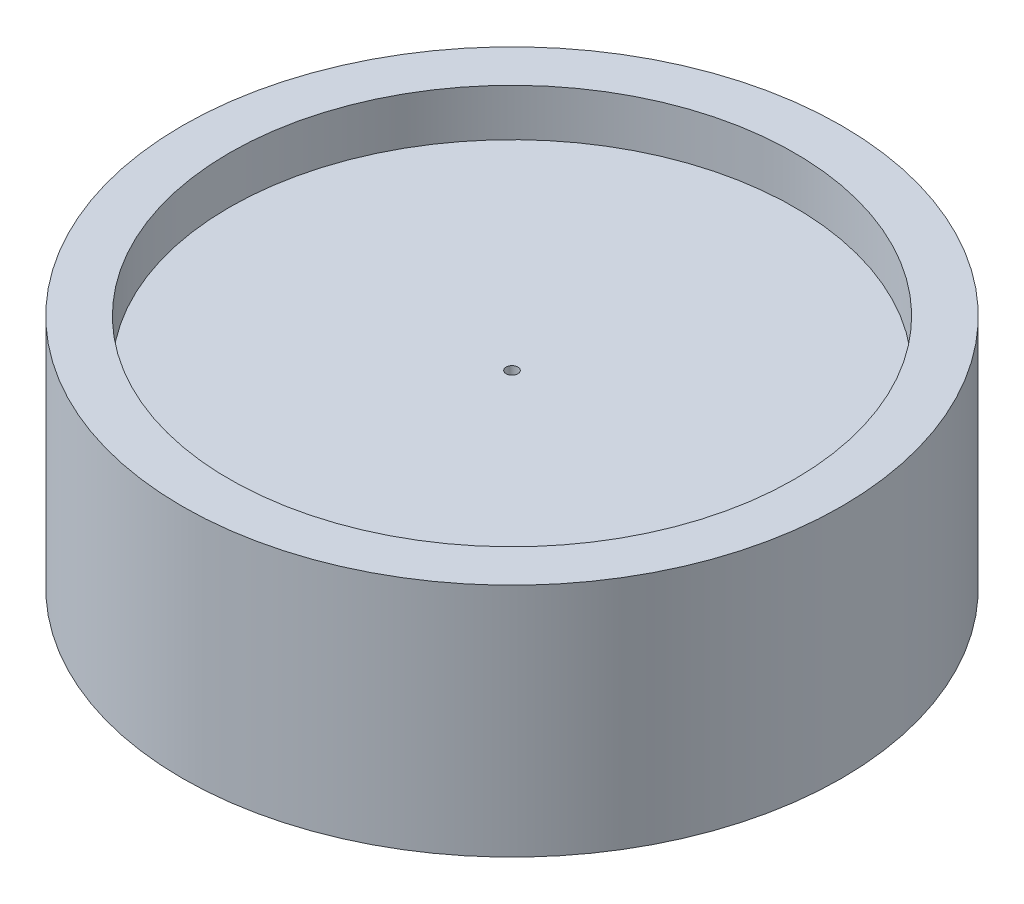
ISO-10303-21;
HEADER;
FILE_DESCRIPTION(('STEP AP214'),'2;1');
FILE_NAME('part.step','',(''),(''),'','','');
FILE_SCHEMA(('AUTOMOTIVE_DESIGN { 1 0 10303 214 1 1 1 1 }'));
ENDSEC;
DATA;
#1=APPLICATION_CONTEXT('core data for automotive mechanical design processes');
#2=APPLICATION_PROTOCOL_DEFINITION('international standard','automotive_design',2000,#1);
#3=PRODUCT_CONTEXT('',#1,'mechanical');
#4=PRODUCT('Part','Part','',(#3));
#5=PRODUCT_RELATED_PRODUCT_CATEGORY('part','',(#4));
#6=PRODUCT_DEFINITION_FORMATION('','',#4);
#7=PRODUCT_DEFINITION_CONTEXT('part definition',#1,'design');
#8=PRODUCT_DEFINITION('design','',#6,#7);
#9=PRODUCT_DEFINITION_SHAPE('','',#8);
#10=(LENGTH_UNIT() NAMED_UNIT(*) SI_UNIT(.MILLI.,.METRE.));
#11=(NAMED_UNIT(*) PLANE_ANGLE_UNIT() SI_UNIT($,.RADIAN.));
#12=(NAMED_UNIT(*) SI_UNIT($,.STERADIAN.) SOLID_ANGLE_UNIT());
#13=UNCERTAINTY_MEASURE_WITH_UNIT(LENGTH_MEASURE(1.E-05),#10,'distance_accuracy_value','');
#14=(GEOMETRIC_REPRESENTATION_CONTEXT(3) GLOBAL_UNCERTAINTY_ASSIGNED_CONTEXT((#13)) GLOBAL_UNIT_ASSIGNED_CONTEXT((#10,
#11,#12)) REPRESENTATION_CONTEXT('',''));
#15=CARTESIAN_POINT('',(0.,0.,0.));
#16=DIRECTION('',(0.,0.,1.));
#17=DIRECTION('',(1.,0.,0.));
#18=AXIS2_PLACEMENT_3D('',#15,#16,#17);
#19=CARTESIAN_POINT('',(0.,0.,0.));
#20=DIRECTION('',(0.,1.,0.));
#21=DIRECTION('',(-1.,0.,0.));
#22=AXIS2_PLACEMENT_3D('',#19,#20,#21);
#23=PLANE('',#22);
#24=CARTESIAN_POINT('',(0.,0.,0.));
#25=DIRECTION('',(0.,1.,0.));
#26=DIRECTION('',(-1.,0.,0.));
#27=AXIS2_PLACEMENT_3D('',#24,#25,#26);
#28=CIRCLE('',#27,1.);
#29=CARTESIAN_POINT('',(-1.,0.,0.));
#30=VERTEX_POINT('',#29);
#31=EDGE_CURVE('E55',#30,#30,#28,.T.);
#32=ORIENTED_EDGE('',*,*,#31,.F.);
#33=EDGE_LOOP('',(#32));
#34=FACE_BOUND('',#33,.T.);
#35=CARTESIAN_POINT('',(0.,0.,0.));
#36=DIRECTION('',(0.,-1.,0.));
#37=DIRECTION('',(1.,0.,0.));
#38=AXIS2_PLACEMENT_3D('',#35,#36,#37);
#39=CIRCLE('',#38,48.);
#40=CARTESIAN_POINT('',(48.,0.,0.));
#41=VERTEX_POINT('',#40);
#42=EDGE_CURVE('E10',#41,#41,#39,.T.);
#43=ORIENTED_EDGE('',*,*,#42,.F.);
#44=EDGE_LOOP('',(#43));
#45=FACE_BOUND('',#44,.T.);
#46=ADVANCED_FACE('F30',(#34,#45),#23,.T.);
#47=CARTESIAN_POINT('',(0.,-12.,0.));
#48=DIRECTION('',(0.,-1.,0.));
#49=DIRECTION('',(1.,0.,0.));
#50=AXIS2_PLACEMENT_3D('',#47,#48,#49);
#51=CYLINDRICAL_SURFACE('',#50,48.);
#52=ORIENTED_EDGE('',*,*,#42,.T.);
#53=EDGE_LOOP('',(#52));
#54=FACE_BOUND('',#53,.T.);
#55=CARTESIAN_POINT('',(0.,8.00000000000001,0.));
#56=DIRECTION('',(0.,-1.,0.));
#57=DIRECTION('',(1.,0.,0.));
#58=AXIS2_PLACEMENT_3D('',#55,#56,#57);
#59=CIRCLE('',#58,48.);
#60=CARTESIAN_POINT('',(48.,8.00000000000001,0.));
#61=VERTEX_POINT('',#60);
#62=EDGE_CURVE('E37',#61,#61,#59,.T.);
#63=ORIENTED_EDGE('',*,*,#62,.F.);
#64=EDGE_LOOP('',(#63));
#65=FACE_BOUND('',#64,.T.);
#66=ADVANCED_FACE('F82',(#54,#65),#51,.F.);
#67=CARTESIAN_POINT('',(48.,8.00000000000001,0.));
#68=DIRECTION('',(0.,1.,0.));
#69=DIRECTION('',(-1.,0.,0.));
#70=AXIS2_PLACEMENT_3D('',#67,#68,#69);
#71=PLANE('',#70);
#72=ORIENTED_EDGE('',*,*,#62,.T.);
#73=EDGE_LOOP('',(#72));
#74=FACE_BOUND('',#73,.T.);
#75=CARTESIAN_POINT('',(0.,8.00000000000001,0.));
#76=DIRECTION('',(0.,-1.,0.));
#77=DIRECTION('',(1.,0.,0.));
#78=AXIS2_PLACEMENT_3D('',#75,#76,#77);
#79=CIRCLE('',#78,56.);
#80=CARTESIAN_POINT('',(56.,8.00000000000001,0.));
#81=VERTEX_POINT('',#80);
#82=EDGE_CURVE('E41',#81,#81,#79,.T.);
#83=ORIENTED_EDGE('',*,*,#82,.F.);
#84=EDGE_LOOP('',(#83));
#85=FACE_BOUND('',#84,.T.);
#86=ADVANCED_FACE('F87',(#74,#85),#71,.T.);
#87=CARTESIAN_POINT('',(0.,-12.,0.));
#88=DIRECTION('',(0.,-1.,0.));
#89=DIRECTION('',(1.,0.,0.));
#90=AXIS2_PLACEMENT_3D('',#87,#88,#89);
#91=CYLINDRICAL_SURFACE('',#90,56.);
#92=ORIENTED_EDGE('',*,*,#82,.T.);
#93=EDGE_LOOP('',(#92));
#94=FACE_BOUND('',#93,.T.);
#95=CARTESIAN_POINT('',(0.,-32.,0.));
#96=DIRECTION('',(0.,-1.,0.));
#97=DIRECTION('',(1.,0.,0.));
#98=AXIS2_PLACEMENT_3D('',#95,#96,#97);
#99=CIRCLE('',#98,56.);
#100=CARTESIAN_POINT('',(56.,-32.,0.));
#101=VERTEX_POINT('',#100);
#102=EDGE_CURVE('E46',#101,#101,#99,.T.);
#103=ORIENTED_EDGE('',*,*,#102,.F.);
#104=EDGE_LOOP('',(#103));
#105=FACE_BOUND('',#104,.T.);
#106=ADVANCED_FACE('F78',(#94,#105),#91,.T.);
#107=CARTESIAN_POINT('',(56.,-32.,0.));
#108=DIRECTION('',(0.,-1.,0.));
#109=DIRECTION('',(1.,0.,0.));
#110=AXIS2_PLACEMENT_3D('',#107,#108,#109);
#111=PLANE('',#110);
#112=ORIENTED_EDGE('',*,*,#102,.T.);
#113=EDGE_LOOP('',(#112));
#114=FACE_BOUND('',#113,.T.);
#115=CARTESIAN_POINT('',(0.,-32.,0.));
#116=DIRECTION('',(0.,-1.,0.));
#117=DIRECTION('',(1.,0.,0.));
#118=AXIS2_PLACEMENT_3D('',#115,#116,#117);
#119=CIRCLE('',#118,48.);
#120=CARTESIAN_POINT('',(48.,-32.,0.));
#121=VERTEX_POINT('',#120);
#122=EDGE_CURVE('E49',#121,#121,#119,.T.);
#123=ORIENTED_EDGE('',*,*,#122,.F.);
#124=EDGE_LOOP('',(#123));
#125=FACE_BOUND('',#124,.T.);
#126=ADVANCED_FACE('F72',(#114,#125),#111,.T.);
#127=CARTESIAN_POINT('',(0.,-12.,0.));
#128=DIRECTION('',(0.,-1.,0.));
#129=DIRECTION('',(1.,0.,0.));
#130=AXIS2_PLACEMENT_3D('',#127,#128,#129);
#131=CYLINDRICAL_SURFACE('',#130,48.);
#132=ORIENTED_EDGE('',*,*,#122,.T.);
#133=EDGE_LOOP('',(#132));
#134=FACE_BOUND('',#133,.T.);
#135=CARTESIAN_POINT('',(0.,-12.,0.));
#136=DIRECTION('',(0.,-1.,0.));
#137=DIRECTION('',(1.,0.,0.));
#138=AXIS2_PLACEMENT_3D('',#135,#136,#137);
#139=CIRCLE('',#138,48.);
#140=CARTESIAN_POINT('',(48.,-12.,0.));
#141=VERTEX_POINT('',#140);
#142=EDGE_CURVE('E52',#141,#141,#139,.T.);
#143=ORIENTED_EDGE('',*,*,#142,.F.);
#144=EDGE_LOOP('',(#143));
#145=FACE_BOUND('',#144,.T.);
#146=ADVANCED_FACE('F67',(#134,#145),#131,.F.);
#147=CARTESIAN_POINT('',(48.,-12.,0.));
#148=DIRECTION('',(0.,-1.,0.));
#149=DIRECTION('',(1.,0.,0.));
#150=AXIS2_PLACEMENT_3D('',#147,#148,#149);
#151=PLANE('',#150);
#152=CARTESIAN_POINT('',(0.,-12.,0.));
#153=DIRECTION('',(0.,-1.,0.));
#154=DIRECTION('',(1.,0.,0.));
#155=AXIS2_PLACEMENT_3D('',#152,#153,#154);
#156=CIRCLE('',#155,1.);
#157=CARTESIAN_POINT('',(0.999999999999999,-12.,0.));
#158=VERTEX_POINT('',#157);
#159=EDGE_CURVE('E33',#158,#158,#156,.T.);
#160=ORIENTED_EDGE('',*,*,#159,.F.);
#161=EDGE_LOOP('',(#160));
#162=FACE_BOUND('',#161,.T.);
#163=ORIENTED_EDGE('',*,*,#142,.T.);
#164=EDGE_LOOP('',(#163));
#165=FACE_BOUND('',#164,.T.);
#166=ADVANCED_FACE('F64',(#162,#165),#151,.T.);
#167=CARTESIAN_POINT('',(0.,-100.,0.));
#168=DIRECTION('',(0.,1.,0.));
#169=DIRECTION('',(-1.,0.,0.));
#170=AXIS2_PLACEMENT_3D('',#167,#168,#169);
#171=CYLINDRICAL_SURFACE('',#170,1.);
#172=ORIENTED_EDGE('',*,*,#159,.T.);
#173=EDGE_LOOP('',(#172));
#174=FACE_BOUND('',#173,.T.);
#175=ORIENTED_EDGE('',*,*,#31,.T.);
#176=EDGE_LOOP('',(#175));
#177=FACE_BOUND('',#176,.T.);
#178=ADVANCED_FACE('F62',(#174,#177),#171,.F.);
#179=CLOSED_SHELL('',(#46,#66,#86,#106,#126,#146,#166,#178));
#180=MANIFOLD_SOLID_BREP('B2',#179);
#181=ADVANCED_BREP_SHAPE_REPRESENTATION('',(#18,#180),#14);
#182=SHAPE_DEFINITION_REPRESENTATION(#9,#181);
ENDSEC;
END-ISO-10303-21;
